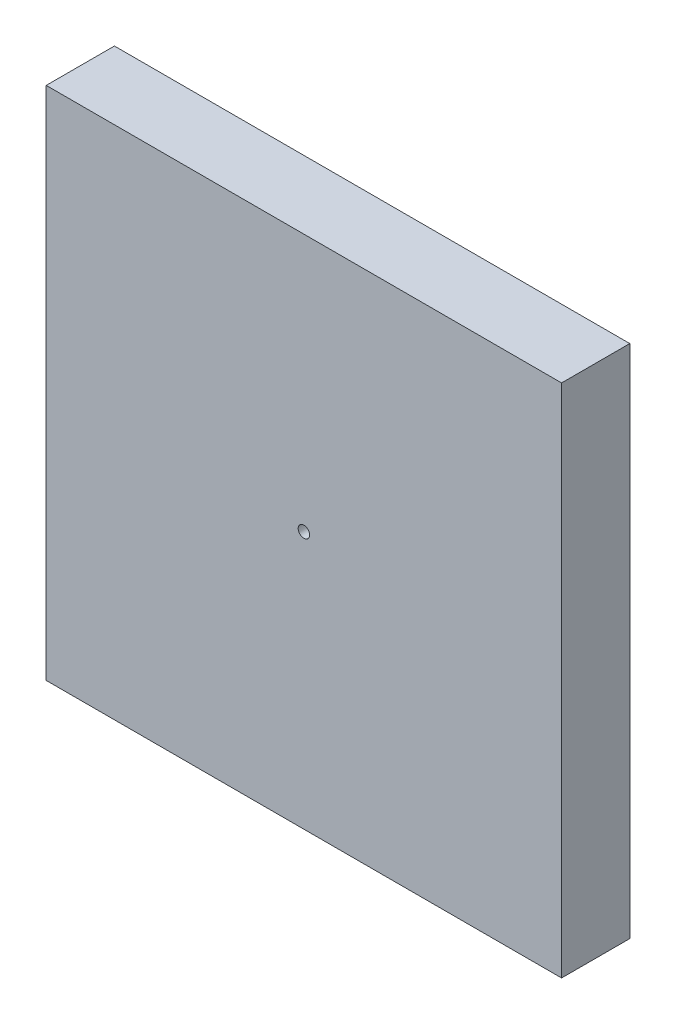
ISO-10303-21;
HEADER;
FILE_DESCRIPTION(('STEP AP214'),'2;1');
FILE_NAME('part.step','',(''),(''),'','','');
FILE_SCHEMA(('AUTOMOTIVE_DESIGN { 1 0 10303 214 1 1 1 1 }'));
ENDSEC;
DATA;
#1=APPLICATION_CONTEXT('core data for automotive mechanical design processes');
#2=APPLICATION_PROTOCOL_DEFINITION('international standard','automotive_design',2000,#1);
#3=PRODUCT_CONTEXT('',#1,'mechanical');
#4=PRODUCT('Part','Part','',(#3));
#5=PRODUCT_RELATED_PRODUCT_CATEGORY('part','',(#4));
#6=PRODUCT_DEFINITION_FORMATION('','',#4);
#7=PRODUCT_DEFINITION_CONTEXT('part definition',#1,'design');
#8=PRODUCT_DEFINITION('design','',#6,#7);
#9=PRODUCT_DEFINITION_SHAPE('','',#8);
#10=(LENGTH_UNIT() NAMED_UNIT(*) SI_UNIT(.MILLI.,.METRE.));
#11=(NAMED_UNIT(*) PLANE_ANGLE_UNIT() SI_UNIT($,.RADIAN.));
#12=(NAMED_UNIT(*) SI_UNIT($,.STERADIAN.) SOLID_ANGLE_UNIT());
#13=UNCERTAINTY_MEASURE_WITH_UNIT(LENGTH_MEASURE(1.E-05),#10,'distance_accuracy_value','');
#14=(GEOMETRIC_REPRESENTATION_CONTEXT(3) GLOBAL_UNCERTAINTY_ASSIGNED_CONTEXT((#13)) GLOBAL_UNIT_ASSIGNED_CONTEXT((#10,
#11,#12)) REPRESENTATION_CONTEXT('',''));
#15=CARTESIAN_POINT('',(0.,0.,0.));
#16=DIRECTION('',(0.,0.,1.));
#17=DIRECTION('',(1.,0.,0.));
#18=AXIS2_PLACEMENT_3D('',#15,#16,#17);
#19=CARTESIAN_POINT('',(0.,0.,11.91));
#20=DIRECTION('',(0.,0.,1.));
#21=DIRECTION('',(1.,0.,0.));
#22=AXIS2_PLACEMENT_3D('',#19,#20,#21);
#23=PLANE('',#22);
#24=DIRECTION('',(0.,-1.,0.));
#25=VECTOR('',#24,1.);
#26=CARTESIAN_POINT('',(45.,50.,11.91));
#27=LINE('',#26,#25);
#28=CARTESIAN_POINT('',(45.,50.,11.91));
#29=VERTEX_POINT('',#28);
#30=CARTESIAN_POINT('',(45.,-40.,11.91));
#31=VERTEX_POINT('',#30);
#32=EDGE_CURVE('E87',#29,#31,#27,.T.);
#33=ORIENTED_EDGE('',*,*,#32,.T.);
#34=DIRECTION('',(1.,0.,0.));
#35=VECTOR('',#34,1.);
#36=CARTESIAN_POINT('',(45.,-40.,11.91));
#37=LINE('',#36,#35);
#38=CARTESIAN_POINT('',(135.,-40.,11.91));
#39=VERTEX_POINT('',#38);
#40=EDGE_CURVE('E82',#31,#39,#37,.T.);
#41=ORIENTED_EDGE('',*,*,#40,.T.);
#42=DIRECTION('',(0.,1.,0.));
#43=VECTOR('',#42,1.);
#44=CARTESIAN_POINT('',(135.,-40.,11.91));
#45=LINE('',#44,#43);
#46=CARTESIAN_POINT('',(135.,50.,11.91));
#47=VERTEX_POINT('',#46);
#48=EDGE_CURVE('E85',#39,#47,#45,.T.);
#49=ORIENTED_EDGE('',*,*,#48,.T.);
#50=DIRECTION('',(-1.,0.,0.));
#51=VECTOR('',#50,1.);
#52=CARTESIAN_POINT('',(135.,50.,11.91));
#53=LINE('',#52,#51);
#54=EDGE_CURVE('E52',#47,#29,#53,.T.);
#55=ORIENTED_EDGE('',*,*,#54,.T.);
#56=EDGE_LOOP('',(#33,#41,#49,#55));
#57=FACE_BOUND('',#56,.T.);
#58=CARTESIAN_POINT('',(90.,5.,11.91));
#59=DIRECTION('',(0.,0.,1.));
#60=DIRECTION('',(1.,0.,0.));
#61=AXIS2_PLACEMENT_3D('',#58,#59,#60);
#62=CIRCLE('',#61,1.);
#63=CARTESIAN_POINT('',(91.,5.,11.91));
#64=VERTEX_POINT('',#63);
#65=EDGE_CURVE('E102',#64,#64,#62,.T.);
#66=ORIENTED_EDGE('',*,*,#65,.F.);
#67=EDGE_LOOP('',(#66));
#68=FACE_BOUND('',#67,.T.);
#69=ADVANCED_FACE('F35',(#57,#68),#23,.T.);
#70=CARTESIAN_POINT('',(0.,0.,0.));
#71=DIRECTION('',(0.,0.,1.));
#72=DIRECTION('',(1.,0.,0.));
#73=AXIS2_PLACEMENT_3D('',#70,#71,#72);
#74=PLANE('',#73);
#75=DIRECTION('',(0.,-1.,0.));
#76=VECTOR('',#75,1.);
#77=CARTESIAN_POINT('',(45.,50.,0.));
#78=LINE('',#77,#76);
#79=CARTESIAN_POINT('',(45.,50.,0.));
#80=VERTEX_POINT('',#79);
#81=CARTESIAN_POINT('',(45.,-40.,0.));
#82=VERTEX_POINT('',#81);
#83=EDGE_CURVE('E99',#80,#82,#78,.T.);
#84=ORIENTED_EDGE('',*,*,#83,.F.);
#85=DIRECTION('',(-1.,0.,0.));
#86=VECTOR('',#85,1.);
#87=CARTESIAN_POINT('',(135.,50.,0.));
#88=LINE('',#87,#86);
#89=CARTESIAN_POINT('',(135.,50.,0.));
#90=VERTEX_POINT('',#89);
#91=EDGE_CURVE('E75',#90,#80,#88,.T.);
#92=ORIENTED_EDGE('',*,*,#91,.F.);
#93=DIRECTION('',(0.,1.,0.));
#94=VECTOR('',#93,1.);
#95=CARTESIAN_POINT('',(135.,-40.,0.));
#96=LINE('',#95,#94);
#97=CARTESIAN_POINT('',(135.,-40.,0.));
#98=VERTEX_POINT('',#97);
#99=EDGE_CURVE('E69',#98,#90,#96,.T.);
#100=ORIENTED_EDGE('',*,*,#99,.F.);
#101=DIRECTION('',(1.,0.,0.));
#102=VECTOR('',#101,1.);
#103=CARTESIAN_POINT('',(45.,-40.,0.));
#104=LINE('',#103,#102);
#105=EDGE_CURVE('E91',#82,#98,#104,.T.);
#106=ORIENTED_EDGE('',*,*,#105,.F.);
#107=EDGE_LOOP('',(#84,#92,#100,#106));
#108=FACE_BOUND('',#107,.T.);
#109=CARTESIAN_POINT('',(90.,5.,0.));
#110=DIRECTION('',(0.,0.,1.));
#111=DIRECTION('',(1.,0.,0.));
#112=AXIS2_PLACEMENT_3D('',#109,#110,#111);
#113=CIRCLE('',#112,1.);
#114=CARTESIAN_POINT('',(91.,5.,0.));
#115=VERTEX_POINT('',#114);
#116=EDGE_CURVE('E114',#115,#115,#113,.T.);
#117=ORIENTED_EDGE('',*,*,#116,.T.);
#118=EDGE_LOOP('',(#117));
#119=FACE_BOUND('',#118,.T.);
#120=ADVANCED_FACE('F110',(#108,#119),#74,.F.);
#121=CARTESIAN_POINT('',(45.,50.,11.91));
#122=DIRECTION('',(1.,0.,0.));
#123=DIRECTION('',(0.,0.,-1.));
#124=AXIS2_PLACEMENT_3D('',#121,#122,#123);
#125=PLANE('',#124);
#126=ORIENTED_EDGE('',*,*,#83,.T.);
#127=DIRECTION('',(0.,0.,-1.));
#128=VECTOR('',#127,1.);
#129=CARTESIAN_POINT('',(45.,-40.,11.91));
#130=LINE('',#129,#128);
#131=EDGE_CURVE('E11',#31,#82,#130,.T.);
#132=ORIENTED_EDGE('',*,*,#131,.F.);
#133=ORIENTED_EDGE('',*,*,#32,.F.);
#134=DIRECTION('',(0.,0.,-1.));
#135=VECTOR('',#134,1.);
#136=CARTESIAN_POINT('',(45.,50.,11.91));
#137=LINE('',#136,#135);
#138=EDGE_CURVE('E95',#29,#80,#137,.T.);
#139=ORIENTED_EDGE('',*,*,#138,.T.);
#140=EDGE_LOOP('',(#126,#132,#133,#139));
#141=FACE_BOUND('',#140,.T.);
#142=ADVANCED_FACE('F37',(#141),#125,.F.);
#143=CARTESIAN_POINT('',(45.,-40.,11.91));
#144=DIRECTION('',(0.,1.,0.));
#145=DIRECTION('',(0.,0.,1.));
#146=AXIS2_PLACEMENT_3D('',#143,#144,#145);
#147=PLANE('',#146);
#148=ORIENTED_EDGE('',*,*,#105,.T.);
#149=DIRECTION('',(0.,0.,-1.));
#150=VECTOR('',#149,1.);
#151=CARTESIAN_POINT('',(135.,-40.,11.91));
#152=LINE('',#151,#150);
#153=EDGE_CURVE('E44',#39,#98,#152,.T.);
#154=ORIENTED_EDGE('',*,*,#153,.F.);
#155=ORIENTED_EDGE('',*,*,#40,.F.);
#156=ORIENTED_EDGE('',*,*,#131,.T.);
#157=EDGE_LOOP('',(#148,#154,#155,#156));
#158=FACE_BOUND('',#157,.T.);
#159=ADVANCED_FACE('F90',(#158),#147,.F.);
#160=CARTESIAN_POINT('',(135.,-40.,11.91));
#161=DIRECTION('',(-1.,0.,0.));
#162=DIRECTION('',(0.,0.,1.));
#163=AXIS2_PLACEMENT_3D('',#160,#161,#162);
#164=PLANE('',#163);
#165=ORIENTED_EDGE('',*,*,#99,.T.);
#166=DIRECTION('',(0.,0.,-1.));
#167=VECTOR('',#166,1.);
#168=CARTESIAN_POINT('',(135.,50.,11.91));
#169=LINE('',#168,#167);
#170=EDGE_CURVE('E92',#47,#90,#169,.T.);
#171=ORIENTED_EDGE('',*,*,#170,.F.);
#172=ORIENTED_EDGE('',*,*,#48,.F.);
#173=ORIENTED_EDGE('',*,*,#153,.T.);
#174=EDGE_LOOP('',(#165,#171,#172,#173));
#175=FACE_BOUND('',#174,.T.);
#176=ADVANCED_FACE('F93',(#175),#164,.F.);
#177=CARTESIAN_POINT('',(135.,50.,11.91));
#178=DIRECTION('',(0.,-1.,0.));
#179=DIRECTION('',(0.,0.,-1.));
#180=AXIS2_PLACEMENT_3D('',#177,#178,#179);
#181=PLANE('',#180);
#182=ORIENTED_EDGE('',*,*,#91,.T.);
#183=ORIENTED_EDGE('',*,*,#138,.F.);
#184=ORIENTED_EDGE('',*,*,#54,.F.);
#185=ORIENTED_EDGE('',*,*,#170,.T.);
#186=EDGE_LOOP('',(#182,#183,#184,#185));
#187=FACE_BOUND('',#186,.T.);
#188=ADVANCED_FACE('F107',(#187),#181,.F.);
#189=CARTESIAN_POINT('',(90.,5.,11.91));
#190=DIRECTION('',(0.,0.,-1.));
#191=DIRECTION('',(-1.,0.,0.));
#192=AXIS2_PLACEMENT_3D('',#189,#190,#191);
#193=CYLINDRICAL_SURFACE('',#192,1.);
#194=ORIENTED_EDGE('',*,*,#65,.T.);
#195=EDGE_LOOP('',(#194));
#196=FACE_BOUND('',#195,.T.);
#197=ORIENTED_EDGE('',*,*,#116,.F.);
#198=EDGE_LOOP('',(#197));
#199=FACE_BOUND('',#198,.T.);
#200=ADVANCED_FACE('F120',(#196,#199),#193,.F.);
#201=CLOSED_SHELL('',(#69,#120,#142,#159,#176,#188,#200));
#202=MANIFOLD_SOLID_BREP('B2',#201);
#203=ADVANCED_BREP_SHAPE_REPRESENTATION('',(#18,#202),#14);
#204=SHAPE_DEFINITION_REPRESENTATION(#9,#203);
ENDSEC;
END-ISO-10303-21;
